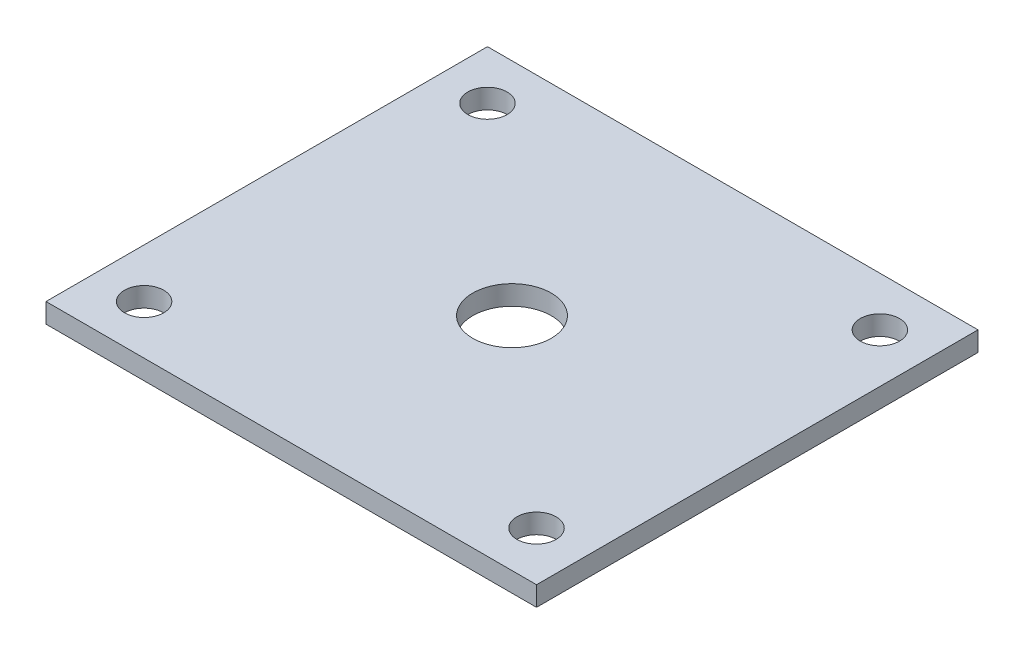
ISO-10303-21;
HEADER;
FILE_DESCRIPTION(('STEP AP214'),'2;1');
FILE_NAME('part.step','',(''),(''),'','','');
FILE_SCHEMA(('AUTOMOTIVE_DESIGN { 1 0 10303 214 1 1 1 1 }'));
ENDSEC;
DATA;
#1=APPLICATION_CONTEXT('core data for automotive mechanical design processes');
#2=APPLICATION_PROTOCOL_DEFINITION('international standard','automotive_design',2000,#1);
#3=PRODUCT_CONTEXT('',#1,'mechanical');
#4=PRODUCT('Part','Part','',(#3));
#5=PRODUCT_RELATED_PRODUCT_CATEGORY('part','',(#4));
#6=PRODUCT_DEFINITION_FORMATION('','',#4);
#7=PRODUCT_DEFINITION_CONTEXT('part definition',#1,'design');
#8=PRODUCT_DEFINITION('design','',#6,#7);
#9=PRODUCT_DEFINITION_SHAPE('','',#8);
#10=(LENGTH_UNIT() NAMED_UNIT(*) SI_UNIT(.MILLI.,.METRE.));
#11=(NAMED_UNIT(*) PLANE_ANGLE_UNIT() SI_UNIT($,.RADIAN.));
#12=(NAMED_UNIT(*) SI_UNIT($,.STERADIAN.) SOLID_ANGLE_UNIT());
#13=UNCERTAINTY_MEASURE_WITH_UNIT(LENGTH_MEASURE(1.E-05),#10,'distance_accuracy_value','');
#14=(GEOMETRIC_REPRESENTATION_CONTEXT(3) GLOBAL_UNCERTAINTY_ASSIGNED_CONTEXT((#13)) GLOBAL_UNIT_ASSIGNED_CONTEXT((#10,
#11,#12)) REPRESENTATION_CONTEXT('',''));
#15=CARTESIAN_POINT('',(0.,0.,0.));
#16=DIRECTION('',(0.,0.,1.));
#17=DIRECTION('',(1.,0.,0.));
#18=AXIS2_PLACEMENT_3D('',#15,#16,#17);
#19=CARTESIAN_POINT('',(0.,4.,0.));
#20=DIRECTION('',(0.,-1.,0.));
#21=DIRECTION('',(0.,0.,-1.));
#22=AXIS2_PLACEMENT_3D('',#19,#20,#21);
#23=PLANE('',#22);
#24=CARTESIAN_POINT('',(90.,4.,-80.));
#25=DIRECTION('',(0.,1.,0.));
#26=DIRECTION('',(0.,0.,1.));
#27=AXIS2_PLACEMENT_3D('',#24,#25,#26);
#28=CIRCLE('',#27,4.00000000000001);
#29=CARTESIAN_POINT('',(90.,4.,-76.));
#30=VERTEX_POINT('',#29);
#31=EDGE_CURVE('E127',#30,#30,#28,.T.);
#32=ORIENTED_EDGE('',*,*,#31,.F.);
#33=EDGE_LOOP('',(#32));
#34=FACE_BOUND('',#33,.T.);
#35=CARTESIAN_POINT('',(10.,4.,-80.));
#36=DIRECTION('',(0.,1.,0.));
#37=DIRECTION('',(0.,0.,1.));
#38=AXIS2_PLACEMENT_3D('',#35,#36,#37);
#39=CIRCLE('',#38,4.00000000000001);
#40=CARTESIAN_POINT('',(10.,4.,-76.));
#41=VERTEX_POINT('',#40);
#42=EDGE_CURVE('E115',#41,#41,#39,.T.);
#43=ORIENTED_EDGE('',*,*,#42,.F.);
#44=EDGE_LOOP('',(#43));
#45=FACE_BOUND('',#44,.T.);
#46=DIRECTION('',(0.,0.,1.));
#47=VECTOR('',#46,1.);
#48=CARTESIAN_POINT('',(0.,4.,0.));
#49=LINE('',#48,#47);
#50=CARTESIAN_POINT('',(0.,4.,-90.));
#51=VERTEX_POINT('',#50);
#52=CARTESIAN_POINT('',(0.,4.,0.));
#53=VERTEX_POINT('',#52);
#54=EDGE_CURVE('E85',#51,#53,#49,.T.);
#55=ORIENTED_EDGE('',*,*,#54,.T.);
#56=DIRECTION('',(1.,0.,0.));
#57=VECTOR('',#56,1.);
#58=CARTESIAN_POINT('',(0.,4.,0.));
#59=LINE('',#58,#57);
#60=CARTESIAN_POINT('',(100.,4.,0.));
#61=VERTEX_POINT('',#60);
#62=EDGE_CURVE('E80',#53,#61,#59,.T.);
#63=ORIENTED_EDGE('',*,*,#62,.T.);
#64=DIRECTION('',(0.,0.,-1.));
#65=VECTOR('',#64,1.);
#66=CARTESIAN_POINT('',(100.,4.,0.));
#67=LINE('',#66,#65);
#68=CARTESIAN_POINT('',(100.,4.,-90.));
#69=VERTEX_POINT('',#68);
#70=EDGE_CURVE('E83',#61,#69,#67,.T.);
#71=ORIENTED_EDGE('',*,*,#70,.T.);
#72=DIRECTION('',(-1.,0.,0.));
#73=VECTOR('',#72,1.);
#74=CARTESIAN_POINT('',(0.,4.,-90.));
#75=LINE('',#74,#73);
#76=EDGE_CURVE('E50',#69,#51,#75,.T.);
#77=ORIENTED_EDGE('',*,*,#76,.T.);
#78=EDGE_LOOP('',(#55,#63,#71,#77));
#79=FACE_BOUND('',#78,.T.);
#80=CARTESIAN_POINT('',(50.,4.,-45.));
#81=DIRECTION('',(0.,1.,0.));
#82=DIRECTION('',(0.,0.,1.));
#83=AXIS2_PLACEMENT_3D('',#80,#81,#82);
#84=CIRCLE('',#83,8.);
#85=CARTESIAN_POINT('',(50.,4.,-37.));
#86=VERTEX_POINT('',#85);
#87=EDGE_CURVE('E100',#86,#86,#84,.T.);
#88=ORIENTED_EDGE('',*,*,#87,.F.);
#89=EDGE_LOOP('',(#88));
#90=FACE_BOUND('',#89,.T.);
#91=CARTESIAN_POINT('',(10.,4.,-10.));
#92=DIRECTION('',(0.,1.,0.));
#93=DIRECTION('',(0.,0.,1.));
#94=AXIS2_PLACEMENT_3D('',#91,#92,#93);
#95=CIRCLE('',#94,4.);
#96=CARTESIAN_POINT('',(10.,4.,-6.));
#97=VERTEX_POINT('',#96);
#98=EDGE_CURVE('E121',#97,#97,#95,.T.);
#99=ORIENTED_EDGE('',*,*,#98,.F.);
#100=EDGE_LOOP('',(#99));
#101=FACE_BOUND('',#100,.T.);
#102=CARTESIAN_POINT('',(90.,4.,-10.));
#103=DIRECTION('',(0.,1.,0.));
#104=DIRECTION('',(0.,0.,1.));
#105=AXIS2_PLACEMENT_3D('',#102,#103,#104);
#106=CIRCLE('',#105,4.00000000000001);
#107=CARTESIAN_POINT('',(90.,4.,-5.99999999999999));
#108=VERTEX_POINT('',#107);
#109=EDGE_CURVE('E133',#108,#108,#106,.T.);
#110=ORIENTED_EDGE('',*,*,#109,.F.);
#111=EDGE_LOOP('',(#110));
#112=FACE_BOUND('',#111,.T.);
#113=ADVANCED_FACE('F33',(#34,#45,#79,#90,#101,#112),#23,.F.);
#114=CARTESIAN_POINT('',(0.,0.,0.));
#115=DIRECTION('',(0.,-1.,0.));
#116=DIRECTION('',(0.,0.,-1.));
#117=AXIS2_PLACEMENT_3D('',#114,#115,#116);
#118=PLANE('',#117);
#119=CARTESIAN_POINT('',(90.,0.,-80.));
#120=DIRECTION('',(0.,1.,0.));
#121=DIRECTION('',(0.,0.,1.));
#122=AXIS2_PLACEMENT_3D('',#119,#120,#121);
#123=CIRCLE('',#122,4.00000000000001);
#124=CARTESIAN_POINT('',(90.,0.,-76.));
#125=VERTEX_POINT('',#124);
#126=EDGE_CURVE('E130',#125,#125,#123,.T.);
#127=ORIENTED_EDGE('',*,*,#126,.T.);
#128=EDGE_LOOP('',(#127));
#129=FACE_BOUND('',#128,.T.);
#130=CARTESIAN_POINT('',(10.,0.,-80.));
#131=DIRECTION('',(0.,1.,0.));
#132=DIRECTION('',(0.,0.,1.));
#133=AXIS2_PLACEMENT_3D('',#130,#131,#132);
#134=CIRCLE('',#133,4.00000000000001);
#135=CARTESIAN_POINT('',(10.,0.,-76.));
#136=VERTEX_POINT('',#135);
#137=EDGE_CURVE('E118',#136,#136,#134,.T.);
#138=ORIENTED_EDGE('',*,*,#137,.T.);
#139=EDGE_LOOP('',(#138));
#140=FACE_BOUND('',#139,.T.);
#141=DIRECTION('',(0.,0.,1.));
#142=VECTOR('',#141,1.);
#143=CARTESIAN_POINT('',(0.,0.,0.));
#144=LINE('',#143,#142);
#145=CARTESIAN_POINT('',(0.,0.,-90.));
#146=VERTEX_POINT('',#145);
#147=CARTESIAN_POINT('',(0.,0.,0.));
#148=VERTEX_POINT('',#147);
#149=EDGE_CURVE('E97',#146,#148,#144,.T.);
#150=ORIENTED_EDGE('',*,*,#149,.F.);
#151=DIRECTION('',(-1.,0.,0.));
#152=VECTOR('',#151,1.);
#153=CARTESIAN_POINT('',(0.,0.,-90.));
#154=LINE('',#153,#152);
#155=CARTESIAN_POINT('',(100.,0.,-90.));
#156=VERTEX_POINT('',#155);
#157=EDGE_CURVE('E73',#156,#146,#154,.T.);
#158=ORIENTED_EDGE('',*,*,#157,.F.);
#159=DIRECTION('',(0.,0.,-1.));
#160=VECTOR('',#159,1.);
#161=CARTESIAN_POINT('',(100.,0.,0.));
#162=LINE('',#161,#160);
#163=CARTESIAN_POINT('',(100.,0.,0.));
#164=VERTEX_POINT('',#163);
#165=EDGE_CURVE('E67',#164,#156,#162,.T.);
#166=ORIENTED_EDGE('',*,*,#165,.F.);
#167=DIRECTION('',(1.,0.,0.));
#168=VECTOR('',#167,1.);
#169=CARTESIAN_POINT('',(0.,0.,0.));
#170=LINE('',#169,#168);
#171=EDGE_CURVE('E89',#148,#164,#170,.T.);
#172=ORIENTED_EDGE('',*,*,#171,.F.);
#173=EDGE_LOOP('',(#150,#158,#166,#172));
#174=FACE_BOUND('',#173,.T.);
#175=CARTESIAN_POINT('',(50.,0.,-45.));
#176=DIRECTION('',(0.,1.,0.));
#177=DIRECTION('',(0.,0.,1.));
#178=AXIS2_PLACEMENT_3D('',#175,#176,#177);
#179=CIRCLE('',#178,8.);
#180=CARTESIAN_POINT('',(50.,0.,-37.));
#181=VERTEX_POINT('',#180);
#182=EDGE_CURVE('E112',#181,#181,#179,.T.);
#183=ORIENTED_EDGE('',*,*,#182,.T.);
#184=EDGE_LOOP('',(#183));
#185=FACE_BOUND('',#184,.T.);
#186=CARTESIAN_POINT('',(10.,0.,-10.));
#187=DIRECTION('',(0.,1.,0.));
#188=DIRECTION('',(0.,0.,1.));
#189=AXIS2_PLACEMENT_3D('',#186,#187,#188);
#190=CIRCLE('',#189,4.);
#191=CARTESIAN_POINT('',(10.,0.,-6.));
#192=VERTEX_POINT('',#191);
#193=EDGE_CURVE('E124',#192,#192,#190,.T.);
#194=ORIENTED_EDGE('',*,*,#193,.T.);
#195=EDGE_LOOP('',(#194));
#196=FACE_BOUND('',#195,.T.);
#197=CARTESIAN_POINT('',(90.,0.,-10.));
#198=DIRECTION('',(0.,1.,0.));
#199=DIRECTION('',(0.,0.,1.));
#200=AXIS2_PLACEMENT_3D('',#197,#198,#199);
#201=CIRCLE('',#200,4.00000000000001);
#202=CARTESIAN_POINT('',(90.,0.,-5.99999999999999));
#203=VERTEX_POINT('',#202);
#204=EDGE_CURVE('E136',#203,#203,#201,.T.);
#205=ORIENTED_EDGE('',*,*,#204,.T.);
#206=EDGE_LOOP('',(#205));
#207=FACE_BOUND('',#206,.T.);
#208=ADVANCED_FACE('F108',(#129,#140,#174,#185,#196,#207),#118,.T.);
#209=CARTESIAN_POINT('',(0.,4.,0.));
#210=DIRECTION('',(1.,0.,0.));
#211=DIRECTION('',(0.,0.,-1.));
#212=AXIS2_PLACEMENT_3D('',#209,#210,#211);
#213=PLANE('',#212);
#214=ORIENTED_EDGE('',*,*,#149,.T.);
#215=DIRECTION('',(0.,-1.,0.));
#216=VECTOR('',#215,1.);
#217=CARTESIAN_POINT('',(0.,4.,0.));
#218=LINE('',#217,#216);
#219=EDGE_CURVE('E11',#53,#148,#218,.T.);
#220=ORIENTED_EDGE('',*,*,#219,.F.);
#221=ORIENTED_EDGE('',*,*,#54,.F.);
#222=DIRECTION('',(0.,-1.,0.));
#223=VECTOR('',#222,1.);
#224=CARTESIAN_POINT('',(0.,4.,-90.));
#225=LINE('',#224,#223);
#226=EDGE_CURVE('E93',#51,#146,#225,.T.);
#227=ORIENTED_EDGE('',*,*,#226,.T.);
#228=EDGE_LOOP('',(#214,#220,#221,#227));
#229=FACE_BOUND('',#228,.T.);
#230=ADVANCED_FACE('F35',(#229),#213,.F.);
#231=CARTESIAN_POINT('',(0.,4.,0.));
#232=DIRECTION('',(0.,0.,-1.));
#233=DIRECTION('',(-1.,0.,0.));
#234=AXIS2_PLACEMENT_3D('',#231,#232,#233);
#235=PLANE('',#234);
#236=ORIENTED_EDGE('',*,*,#171,.T.);
#237=DIRECTION('',(0.,-1.,0.));
#238=VECTOR('',#237,1.);
#239=CARTESIAN_POINT('',(100.,4.,0.));
#240=LINE('',#239,#238);
#241=EDGE_CURVE('E42',#61,#164,#240,.T.);
#242=ORIENTED_EDGE('',*,*,#241,.F.);
#243=ORIENTED_EDGE('',*,*,#62,.F.);
#244=ORIENTED_EDGE('',*,*,#219,.T.);
#245=EDGE_LOOP('',(#236,#242,#243,#244));
#246=FACE_BOUND('',#245,.T.);
#247=ADVANCED_FACE('F88',(#246),#235,.F.);
#248=CARTESIAN_POINT('',(100.,4.,0.));
#249=DIRECTION('',(-1.,0.,0.));
#250=DIRECTION('',(0.,0.,1.));
#251=AXIS2_PLACEMENT_3D('',#248,#249,#250);
#252=PLANE('',#251);
#253=ORIENTED_EDGE('',*,*,#165,.T.);
#254=DIRECTION('',(0.,-1.,0.));
#255=VECTOR('',#254,1.);
#256=CARTESIAN_POINT('',(100.,4.,-90.));
#257=LINE('',#256,#255);
#258=EDGE_CURVE('E90',#69,#156,#257,.T.);
#259=ORIENTED_EDGE('',*,*,#258,.F.);
#260=ORIENTED_EDGE('',*,*,#70,.F.);
#261=ORIENTED_EDGE('',*,*,#241,.T.);
#262=EDGE_LOOP('',(#253,#259,#260,#261));
#263=FACE_BOUND('',#262,.T.);
#264=ADVANCED_FACE('F91',(#263),#252,.F.);
#265=CARTESIAN_POINT('',(0.,4.,-90.));
#266=DIRECTION('',(0.,0.,1.));
#267=DIRECTION('',(1.,0.,0.));
#268=AXIS2_PLACEMENT_3D('',#265,#266,#267);
#269=PLANE('',#268);
#270=ORIENTED_EDGE('',*,*,#157,.T.);
#271=ORIENTED_EDGE('',*,*,#226,.F.);
#272=ORIENTED_EDGE('',*,*,#76,.F.);
#273=ORIENTED_EDGE('',*,*,#258,.T.);
#274=EDGE_LOOP('',(#270,#271,#272,#273));
#275=FACE_BOUND('',#274,.T.);
#276=ADVANCED_FACE('F105',(#275),#269,.F.);
#277=CARTESIAN_POINT('',(50.,4.,-45.));
#278=DIRECTION('',(0.,-1.,0.));
#279=DIRECTION('',(0.,0.,-1.));
#280=AXIS2_PLACEMENT_3D('',#277,#278,#279);
#281=CYLINDRICAL_SURFACE('',#280,8.);
#282=ORIENTED_EDGE('',*,*,#87,.T.);
#283=EDGE_LOOP('',(#282));
#284=FACE_BOUND('',#283,.T.);
#285=ORIENTED_EDGE('',*,*,#182,.F.);
#286=EDGE_LOOP('',(#285));
#287=FACE_BOUND('',#286,.T.);
#288=ADVANCED_FACE('F156',(#284,#287),#281,.F.);
#289=CARTESIAN_POINT('',(10.,4.,-80.));
#290=DIRECTION('',(0.,-1.,0.));
#291=DIRECTION('',(0.,0.,-1.));
#292=AXIS2_PLACEMENT_3D('',#289,#290,#291);
#293=CYLINDRICAL_SURFACE('',#292,4.00000000000001);
#294=ORIENTED_EDGE('',*,*,#42,.T.);
#295=EDGE_LOOP('',(#294));
#296=FACE_BOUND('',#295,.T.);
#297=ORIENTED_EDGE('',*,*,#137,.F.);
#298=EDGE_LOOP('',(#297));
#299=FACE_BOUND('',#298,.T.);
#300=ADVANCED_FACE('F202',(#296,#299),#293,.F.);
#301=CARTESIAN_POINT('',(10.,4.,-10.));
#302=DIRECTION('',(0.,-1.,0.));
#303=DIRECTION('',(0.,0.,-1.));
#304=AXIS2_PLACEMENT_3D('',#301,#302,#303);
#305=CYLINDRICAL_SURFACE('',#304,4.);
#306=ORIENTED_EDGE('',*,*,#98,.T.);
#307=EDGE_LOOP('',(#306));
#308=FACE_BOUND('',#307,.T.);
#309=ORIENTED_EDGE('',*,*,#193,.F.);
#310=EDGE_LOOP('',(#309));
#311=FACE_BOUND('',#310,.T.);
#312=ADVANCED_FACE('F210',(#308,#311),#305,.F.);
#313=CARTESIAN_POINT('',(90.,4.,-80.));
#314=DIRECTION('',(0.,-1.,0.));
#315=DIRECTION('',(0.,0.,-1.));
#316=AXIS2_PLACEMENT_3D('',#313,#314,#315);
#317=CYLINDRICAL_SURFACE('',#316,4.00000000000001);
#318=ORIENTED_EDGE('',*,*,#31,.T.);
#319=EDGE_LOOP('',(#318));
#320=FACE_BOUND('',#319,.T.);
#321=ORIENTED_EDGE('',*,*,#126,.F.);
#322=EDGE_LOOP('',(#321));
#323=FACE_BOUND('',#322,.T.);
#324=ADVANCED_FACE('F218',(#320,#323),#317,.F.);
#325=CARTESIAN_POINT('',(90.,4.,-10.));
#326=DIRECTION('',(0.,-1.,0.));
#327=DIRECTION('',(0.,0.,-1.));
#328=AXIS2_PLACEMENT_3D('',#325,#326,#327);
#329=CYLINDRICAL_SURFACE('',#328,4.00000000000001);
#330=ORIENTED_EDGE('',*,*,#109,.T.);
#331=EDGE_LOOP('',(#330));
#332=FACE_BOUND('',#331,.T.);
#333=ORIENTED_EDGE('',*,*,#204,.F.);
#334=EDGE_LOOP('',(#333));
#335=FACE_BOUND('',#334,.T.);
#336=ADVANCED_FACE('F142',(#332,#335),#329,.F.);
#337=CLOSED_SHELL('',(#113,#208,#230,#247,#264,#276,#288,#300,#312,#324,#336));
#338=MANIFOLD_SOLID_BREP('B2',#337);
#339=ADVANCED_BREP_SHAPE_REPRESENTATION('',(#18,#338),#14);
#340=SHAPE_DEFINITION_REPRESENTATION(#9,#339);
ENDSEC;
END-ISO-10303-21;
